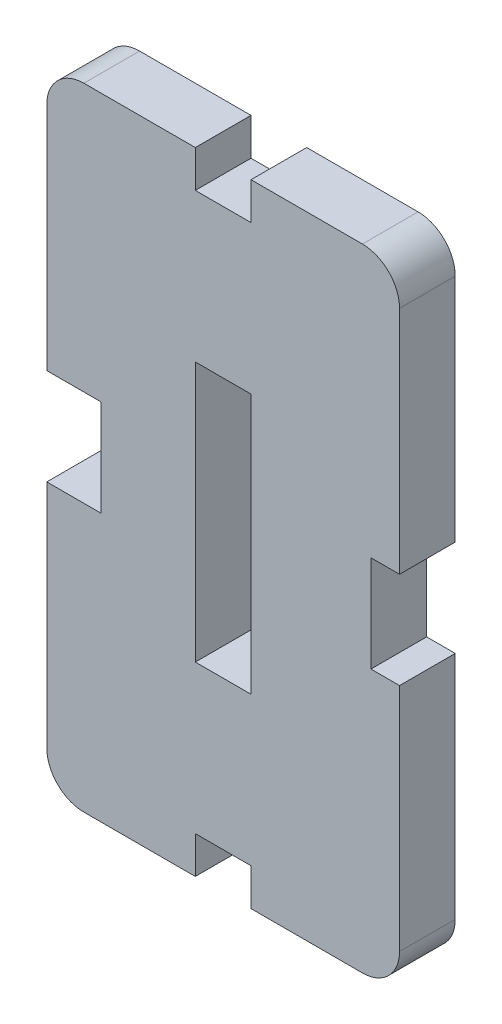
ISO-10303-21;
HEADER;
FILE_DESCRIPTION(('STEP AP214'),'2;1');
FILE_NAME('part.step','',(''),(''),'','','');
FILE_SCHEMA(('AUTOMOTIVE_DESIGN { 1 0 10303 214 1 1 1 1 }'));
ENDSEC;
DATA;
#1=APPLICATION_CONTEXT('core data for automotive mechanical design processes');
#2=APPLICATION_PROTOCOL_DEFINITION('international standard','automotive_design',2000,#1);
#3=PRODUCT_CONTEXT('',#1,'mechanical');
#4=PRODUCT('Part','Part','',(#3));
#5=PRODUCT_RELATED_PRODUCT_CATEGORY('part','',(#4));
#6=PRODUCT_DEFINITION_FORMATION('','',#4);
#7=PRODUCT_DEFINITION_CONTEXT('part definition',#1,'design');
#8=PRODUCT_DEFINITION('design','',#6,#7);
#9=PRODUCT_DEFINITION_SHAPE('','',#8);
#10=(LENGTH_UNIT() NAMED_UNIT(*) SI_UNIT(.MILLI.,.METRE.));
#11=(NAMED_UNIT(*) PLANE_ANGLE_UNIT() SI_UNIT($,.RADIAN.));
#12=(NAMED_UNIT(*) SI_UNIT($,.STERADIAN.) SOLID_ANGLE_UNIT());
#13=UNCERTAINTY_MEASURE_WITH_UNIT(LENGTH_MEASURE(1.E-05),#10,'distance_accuracy_value','');
#14=(GEOMETRIC_REPRESENTATION_CONTEXT(3) GLOBAL_UNCERTAINTY_ASSIGNED_CONTEXT((#13)) GLOBAL_UNIT_ASSIGNED_CONTEXT((#10,
#11,#12)) REPRESENTATION_CONTEXT('',''));
#15=CARTESIAN_POINT('',(0.,0.,0.));
#16=DIRECTION('',(0.,0.,1.));
#17=DIRECTION('',(1.,0.,0.));
#18=AXIS2_PLACEMENT_3D('',#15,#16,#17);
#19=CARTESIAN_POINT('',(-1050.11691061095,53.9977448376063,3.00000000000027));
#20=DIRECTION('',(0.,0.,-1.));
#21=DIRECTION('',(-1.,0.,0.));
#22=AXIS2_PLACEMENT_3D('',#19,#20,#21);
#23=PLANE('',#22);
#24=CARTESIAN_POINT('',(-1050.11691061095,53.9977448376063,3.00000000000027));
#25=DIRECTION('',(0.,0.,1.));
#26=DIRECTION('',(-1.,0.,0.));
#27=AXIS2_PLACEMENT_3D('',#24,#25,#26);
#28=CIRCLE('',#27,2.);
#29=CARTESIAN_POINT('',(-1050.11691061095,55.9977448376064,3.00000000000031));
#30=VERTEX_POINT('',#29);
#31=CARTESIAN_POINT('',(-1052.11691061095,53.9977448376066,3.00000000000047));
#32=VERTEX_POINT('',#31);
#33=EDGE_CURVE('E303',#30,#32,#28,.T.);
#34=ORIENTED_EDGE('',*,*,#33,.T.);
#35=DIRECTION('',(0.,-1.,0.));
#36=VECTOR('',#35,1.);
#37=CARTESIAN_POINT('',(-1052.11691061095,41.5930739118341,3.00000000000052));
#38=LINE('',#37,#36);
#39=CARTESIAN_POINT('',(-1052.11691061095,41.5930739118341,3.00000000000052));
#40=VERTEX_POINT('',#39);
#41=EDGE_CURVE('E306',#32,#40,#38,.T.);
#42=ORIENTED_EDGE('',*,*,#41,.T.);
#43=DIRECTION('',(1.,0.,0.));
#44=VECTOR('',#43,1.);
#45=CARTESIAN_POINT('',(-1049.19041833405,41.593073911834,3.00000000000029));
#46=LINE('',#45,#44);
#47=CARTESIAN_POINT('',(-1049.19041833405,41.593073911834,3.00000000000029));
#48=VERTEX_POINT('',#47);
#49=EDGE_CURVE('E308',#40,#48,#46,.T.);
#50=ORIENTED_EDGE('',*,*,#49,.T.);
#51=DIRECTION('',(0.,-1.,0.));
#52=VECTOR('',#51,1.);
#53=CARTESIAN_POINT('',(-1049.19041833405,36.4024157633791,3.00000000000026));
#54=LINE('',#53,#52);
#55=CARTESIAN_POINT('',(-1049.19041833405,36.4024157633791,3.00000000000026));
#56=VERTEX_POINT('',#55);
#57=EDGE_CURVE('E310',#48,#56,#54,.T.);
#58=ORIENTED_EDGE('',*,*,#57,.T.);
#59=DIRECTION('',(-1.,0.,0.));
#60=VECTOR('',#59,1.);
#61=CARTESIAN_POINT('',(-1049.19041833405,36.4024157633791,3.00000000000026));
#62=LINE('',#61,#60);
#63=CARTESIAN_POINT('',(-1052.11691061095,36.4024157633793,3.00000000000043));
#64=VERTEX_POINT('',#63);
#65=EDGE_CURVE('E312',#56,#64,#62,.T.);
#66=ORIENTED_EDGE('',*,*,#65,.T.);
#67=DIRECTION('',(0.,-1.,0.));
#68=VECTOR('',#67,1.);
#69=CARTESIAN_POINT('',(-1052.11691061095,36.4024157633793,3.00000000000043));
#70=LINE('',#69,#68);
#71=CARTESIAN_POINT('',(-1052.11691061095,23.9977448376065,3.00000000000061));
#72=VERTEX_POINT('',#71);
#73=EDGE_CURVE('E314',#64,#72,#70,.T.);
#74=ORIENTED_EDGE('',*,*,#73,.T.);
#75=CARTESIAN_POINT('',(-1050.11691061095,23.9977448376063,3.00000000000037));
#76=DIRECTION('',(0.,0.,1.));
#77=DIRECTION('',(1.,0.,0.));
#78=AXIS2_PLACEMENT_3D('',#75,#76,#77);
#79=CIRCLE('',#78,2.00000000000011);
#80=CARTESIAN_POINT('',(-1050.11691061095,21.9977448376063,3.00000000000036));
#81=VERTEX_POINT('',#80);
#82=EDGE_CURVE('E316',#72,#81,#79,.T.);
#83=ORIENTED_EDGE('',*,*,#82,.T.);
#84=DIRECTION('',(1.,0.,0.));
#85=VECTOR('',#84,1.);
#86=CARTESIAN_POINT('',(-1050.11691061095,21.9977448376063,3.00000000000023));
#87=LINE('',#86,#85);
#88=CARTESIAN_POINT('',(-1044.11691061095,21.9977448376067,3.00000000000052));
#89=VERTEX_POINT('',#88);
#90=EDGE_CURVE('E318',#81,#89,#87,.T.);
#91=ORIENTED_EDGE('',*,*,#90,.T.);
#92=DIRECTION('',(0.,1.,0.));
#93=VECTOR('',#92,1.);
#94=CARTESIAN_POINT('',(-1044.11691061095,23.9977448376067,3.00000000000052));
#95=LINE('',#94,#93);
#96=CARTESIAN_POINT('',(-1044.11691061095,23.9977448376067,3.00000000000052));
#97=VERTEX_POINT('',#96);
#98=EDGE_CURVE('E320',#89,#97,#95,.T.);
#99=ORIENTED_EDGE('',*,*,#98,.T.);
#100=DIRECTION('',(1.,0.,0.));
#101=VECTOR('',#100,1.);
#102=CARTESIAN_POINT('',(-1042.61691061095,23.9977448376064,3.00000000000032));
#103=LINE('',#102,#101);
#104=CARTESIAN_POINT('',(-1041.11691061095,23.9977448376063,3.00000000000039));
#105=VERTEX_POINT('',#104);
#106=EDGE_CURVE('E322',#97,#105,#103,.T.);
#107=ORIENTED_EDGE('',*,*,#106,.T.);
#108=DIRECTION('',(0.,-1.,0.));
#109=VECTOR('',#108,1.);
#110=CARTESIAN_POINT('',(-1041.11691061095,23.9977448376063,3.00000000000039));
#111=LINE('',#110,#109);
#112=CARTESIAN_POINT('',(-1041.11691061095,21.9977448376064,3.00000000000043));
#113=VERTEX_POINT('',#112);
#114=EDGE_CURVE('E324',#105,#113,#111,.T.);
#115=ORIENTED_EDGE('',*,*,#114,.T.);
#116=DIRECTION('',(1.,0.,0.));
#117=VECTOR('',#116,1.);
#118=CARTESIAN_POINT('',(-1041.11691061095,21.9977448376064,3.00000000000043));
#119=LINE('',#118,#117);
#120=CARTESIAN_POINT('',(-1035.11691061095,21.9977448376063,3.00000000000022));
#121=VERTEX_POINT('',#120);
#122=EDGE_CURVE('E326',#113,#121,#119,.T.);
#123=ORIENTED_EDGE('',*,*,#122,.T.);
#124=CARTESIAN_POINT('',(-1035.11691061095,23.9977448376063,3.00000000000027));
#125=DIRECTION('',(0.,0.,1.));
#126=DIRECTION('',(-1.,0.,0.));
#127=AXIS2_PLACEMENT_3D('',#124,#125,#126);
#128=CIRCLE('',#127,2.);
#129=CARTESIAN_POINT('',(-1033.11691061095,23.9977448376066,3.00000000000048));
#130=VERTEX_POINT('',#129);
#131=EDGE_CURVE('E328',#121,#130,#128,.T.);
#132=ORIENTED_EDGE('',*,*,#131,.T.);
#133=DIRECTION('',(0.,1.,0.));
#134=VECTOR('',#133,1.);
#135=CARTESIAN_POINT('',(-1033.11691061095,23.9977448376066,3.00000000000048));
#136=LINE('',#135,#134);
#137=CARTESIAN_POINT('',(-1033.11691061095,36.4024157633791,3.00000000000038));
#138=VERTEX_POINT('',#137);
#139=EDGE_CURVE('E330',#130,#138,#136,.T.);
#140=ORIENTED_EDGE('',*,*,#139,.T.);
#141=DIRECTION('',(-0.999999999999999,0.,0.));
#142=VECTOR('',#141,1.);
#143=CARTESIAN_POINT('',(-1033.11691061095,36.4024157633791,3.00000000000038));
#144=LINE('',#143,#142);
#145=CARTESIAN_POINT('',(-1034.65769352971,36.402415763379,3.00000000000029));
#146=VERTEX_POINT('',#145);
#147=EDGE_CURVE('E332',#138,#146,#144,.T.);
#148=ORIENTED_EDGE('',*,*,#147,.T.);
#149=DIRECTION('',(0.,1.,0.));
#150=VECTOR('',#149,1.);
#151=CARTESIAN_POINT('',(-1034.65769352971,41.5930739118338,3.00000000000036));
#152=LINE('',#151,#150);
#153=CARTESIAN_POINT('',(-1034.65769352971,41.5930739118338,3.00000000000036));
#154=VERTEX_POINT('',#153);
#155=EDGE_CURVE('E334',#146,#154,#152,.T.);
#156=ORIENTED_EDGE('',*,*,#155,.T.);
#157=DIRECTION('',(0.999999999999999,0.,0.));
#158=VECTOR('',#157,1.);
#159=CARTESIAN_POINT('',(-1033.11691061095,41.5930739118338,3.0000000000005));
#160=LINE('',#159,#158);
#161=CARTESIAN_POINT('',(-1033.11691061095,41.5930739118338,3.0000000000005));
#162=VERTEX_POINT('',#161);
#163=EDGE_CURVE('E336',#154,#162,#160,.T.);
#164=ORIENTED_EDGE('',*,*,#163,.T.);
#165=DIRECTION('',(0.,1.,0.));
#166=VECTOR('',#165,1.);
#167=CARTESIAN_POINT('',(-1033.11691061095,53.9977448376065,3.00000000000048));
#168=LINE('',#167,#166);
#169=CARTESIAN_POINT('',(-1033.11691061095,53.9977448376065,3.00000000000048));
#170=VERTEX_POINT('',#169);
#171=EDGE_CURVE('E338',#162,#170,#168,.T.);
#172=ORIENTED_EDGE('',*,*,#171,.T.);
#173=CARTESIAN_POINT('',(-1035.11691061095,53.9977448376063,3.00000000000022));
#174=DIRECTION('',(0.,0.,1.));
#175=DIRECTION('',(1.,0.,0.));
#176=AXIS2_PLACEMENT_3D('',#173,#174,#175);
#177=CIRCLE('',#176,2.);
#178=CARTESIAN_POINT('',(-1035.11691061095,55.9977448376063,3.0000000000002));
#179=VERTEX_POINT('',#178);
#180=EDGE_CURVE('E340',#170,#179,#177,.T.);
#181=ORIENTED_EDGE('',*,*,#180,.T.);
#182=DIRECTION('',(-1.,0.,0.));
#183=VECTOR('',#182,1.);
#184=CARTESIAN_POINT('',(-1041.11691061095,55.9977448376064,3.00000000000043));
#185=LINE('',#184,#183);
#186=CARTESIAN_POINT('',(-1041.11691061095,55.9977448376064,3.00000000000043));
#187=VERTEX_POINT('',#186);
#188=EDGE_CURVE('E342',#179,#187,#185,.T.);
#189=ORIENTED_EDGE('',*,*,#188,.T.);
#190=DIRECTION('',(0.,-1.,0.));
#191=VECTOR('',#190,1.);
#192=CARTESIAN_POINT('',(-1041.11691061095,53.9977448376063,3.00000000000043));
#193=LINE('',#192,#191);
#194=CARTESIAN_POINT('',(-1041.11691061095,53.9977448376063,3.00000000000043));
#195=VERTEX_POINT('',#194);
#196=EDGE_CURVE('E344',#187,#195,#193,.T.);
#197=ORIENTED_EDGE('',*,*,#196,.T.);
#198=DIRECTION('',(-1.,0.,0.));
#199=VECTOR('',#198,1.);
#200=CARTESIAN_POINT('',(-1042.61691061095,53.9977448376064,3.00000000000046));
#201=LINE('',#200,#199);
#202=CARTESIAN_POINT('',(-1044.11691061095,53.9977448376067,3.00000000000059));
#203=VERTEX_POINT('',#202);
#204=EDGE_CURVE('E346',#195,#203,#201,.T.);
#205=ORIENTED_EDGE('',*,*,#204,.T.);
#206=DIRECTION('',(0.,1.,0.));
#207=VECTOR('',#206,1.);
#208=CARTESIAN_POINT('',(-1044.11691061095,53.9977448376067,3.00000000000059));
#209=LINE('',#208,#207);
#210=CARTESIAN_POINT('',(-1044.11691061095,55.9977448376066,3.00000000000061));
#211=VERTEX_POINT('',#210);
#212=EDGE_CURVE('E348',#203,#211,#209,.T.);
#213=ORIENTED_EDGE('',*,*,#212,.T.);
#214=DIRECTION('',(-1.,0.,0.));
#215=VECTOR('',#214,1.);
#216=CARTESIAN_POINT('',(-1050.11691061095,55.9977448376064,3.00000000000031));
#217=LINE('',#216,#215);
#218=EDGE_CURVE('E350',#211,#30,#217,.T.);
#219=ORIENTED_EDGE('',*,*,#218,.T.);
#220=EDGE_LOOP('',(#34,#42,#50,#58,#66,#74,#83,#91,#99,#107,#115,#123,#132,#140,#148,#156,#164,
#172,#181,#189,#197,#205,#213,#219));
#221=FACE_BOUND('',#220,.T.);
#222=DIRECTION('',(-1.,0.,0.));
#223=VECTOR('',#222,1.);
#224=CARTESIAN_POINT('',(-1041.11691061095,45.9977448376063,3.00000000000037));
#225=LINE('',#224,#223);
#226=CARTESIAN_POINT('',(-1041.11691061095,45.9977448376063,3.00000000000037));
#227=VERTEX_POINT('',#226);
#228=CARTESIAN_POINT('',(-1044.11691061095,45.9977448376067,3.00000000000037));
#229=VERTEX_POINT('',#228);
#230=EDGE_CURVE('E232',#227,#229,#225,.T.);
#231=ORIENTED_EDGE('',*,*,#230,.F.);
#232=DIRECTION('',(0.,1.,0.));
#233=VECTOR('',#232,1.);
#234=CARTESIAN_POINT('',(-1041.11691061095,31.9977448376064,3.00000000000038));
#235=LINE('',#234,#233);
#236=CARTESIAN_POINT('',(-1041.11691061095,31.9977448376064,3.00000000000038));
#237=VERTEX_POINT('',#236);
#238=EDGE_CURVE('E247',#237,#227,#235,.T.);
#239=ORIENTED_EDGE('',*,*,#238,.F.);
#240=DIRECTION('',(1.,0.,0.));
#241=VECTOR('',#240,1.);
#242=CARTESIAN_POINT('',(-1041.11691061095,31.9977448376064,3.00000000000038));
#243=LINE('',#242,#241);
#244=CARTESIAN_POINT('',(-1044.11691061095,31.9977448376065,3.00000000000036));
#245=VERTEX_POINT('',#244);
#246=EDGE_CURVE('E245',#245,#237,#243,.T.);
#247=ORIENTED_EDGE('',*,*,#246,.F.);
#248=DIRECTION('',(0.,-1.,0.));
#249=VECTOR('',#248,1.);
#250=CARTESIAN_POINT('',(-1044.11691061095,45.9977448376067,3.00000000000037));
#251=LINE('',#250,#249);
#252=EDGE_CURVE('E243',#229,#245,#251,.T.);
#253=ORIENTED_EDGE('',*,*,#252,.F.);
#254=EDGE_LOOP('',(#231,#239,#247,#253));
#255=FACE_BOUND('',#254,.T.);
#256=ADVANCED_FACE('F32',(#221,#255),#23,.F.);
#257=CARTESIAN_POINT('',(-1050.11691061095,53.9977448376064,3.2612801348364E-13));
#258=DIRECTION('',(0.,0.,-1.));
#259=DIRECTION('',(-1.,0.,0.));
#260=AXIS2_PLACEMENT_3D('',#257,#258,#259);
#261=PLANE('',#260);
#262=CARTESIAN_POINT('',(-1050.11691061095,53.9977448376064,3.2612801348364E-13));
#263=DIRECTION('',(0.,0.,1.));
#264=DIRECTION('',(-1.,0.,0.));
#265=AXIS2_PLACEMENT_3D('',#262,#263,#264);
#266=CIRCLE('',#265,2.);
#267=CARTESIAN_POINT('',(-1050.11691061095,55.9977448376062,3.19189119579733E-13));
#268=VERTEX_POINT('',#267);
#269=CARTESIAN_POINT('',(-1052.11691061095,53.9977448376066,5.06539254985228E-13));
#270=VERTEX_POINT('',#269);
#271=EDGE_CURVE('E233',#268,#270,#266,.T.);
#272=ORIENTED_EDGE('',*,*,#271,.F.);
#273=DIRECTION('',(-1.,0.,0.));
#274=VECTOR('',#273,1.);
#275=CARTESIAN_POINT('',(-1050.11691061095,55.9977448376062,3.19189119579733E-13));
#276=LINE('',#275,#274);
#277=CARTESIAN_POINT('',(-1044.11691061095,55.9977448376066,4.44089209850063E-13));
#278=VERTEX_POINT('',#277);
#279=EDGE_CURVE('E301',#278,#268,#276,.T.);
#280=ORIENTED_EDGE('',*,*,#279,.F.);
#281=DIRECTION('',(0.,1.,0.));
#282=VECTOR('',#281,1.);
#283=CARTESIAN_POINT('',(-1044.11691061095,53.9977448376066,4.37150315946155E-13));
#284=LINE('',#283,#282);
#285=CARTESIAN_POINT('',(-1044.11691061095,53.9977448376066,4.37150315946155E-13));
#286=VERTEX_POINT('',#285);
#287=EDGE_CURVE('E299',#286,#278,#284,.T.);
#288=ORIENTED_EDGE('',*,*,#287,.F.);
#289=DIRECTION('',(-1.,0.,0.));
#290=VECTOR('',#289,1.);
#291=CARTESIAN_POINT('',(-1042.61691061095,53.9977448376064,3.46944695195361E-13));
#292=LINE('',#291,#290);
#293=CARTESIAN_POINT('',(-1041.11691061095,53.9977448376064,5.13478148889135E-13));
#294=VERTEX_POINT('',#293);
#295=EDGE_CURVE('E297',#294,#286,#292,.T.);
#296=ORIENTED_EDGE('',*,*,#295,.F.);
#297=DIRECTION('',(0.,-1.,0.));
#298=VECTOR('',#297,1.);
#299=CARTESIAN_POINT('',(-1041.11691061095,53.9977448376064,5.13478148889135E-13));
#300=LINE('',#299,#298);
#301=CARTESIAN_POINT('',(-1041.11691061095,55.9977448376064,3.7470027081099E-13));
#302=VERTEX_POINT('',#301);
#303=EDGE_CURVE('E294',#302,#294,#300,.T.);
#304=ORIENTED_EDGE('',*,*,#303,.F.);
#305=DIRECTION('',(-1.,0.,0.));
#306=VECTOR('',#305,1.);
#307=CARTESIAN_POINT('',(-1041.11691061095,55.9977448376064,3.7470027081099E-13));
#308=LINE('',#307,#306);
#309=CARTESIAN_POINT('',(-1035.11691061095,55.9977448376063,1.94289029309402E-13));
#310=VERTEX_POINT('',#309);
#311=EDGE_CURVE('E292',#310,#302,#308,.T.);
#312=ORIENTED_EDGE('',*,*,#311,.F.);
#313=CARTESIAN_POINT('',(-1035.11691061095,53.9977448376064,3.95516952522712E-13));
#314=DIRECTION('',(0.,0.,1.));
#315=DIRECTION('',(1.,0.,0.));
#316=AXIS2_PLACEMENT_3D('',#313,#314,#315);
#317=CIRCLE('',#316,2.);
#318=CARTESIAN_POINT('',(-1033.11691061095,53.9977448376065,4.44089209850063E-13));
#319=VERTEX_POINT('',#318);
#320=EDGE_CURVE('E290',#319,#310,#317,.T.);
#321=ORIENTED_EDGE('',*,*,#320,.F.);
#322=DIRECTION('',(0.,1.,0.));
#323=VECTOR('',#322,1.);
#324=CARTESIAN_POINT('',(-1033.11691061095,53.9977448376065,4.44089209850063E-13));
#325=LINE('',#324,#323);
#326=CARTESIAN_POINT('',(-1033.11691061095,41.593073911834,5.41233724504764E-13));
#327=VERTEX_POINT('',#326);
#328=EDGE_CURVE('E288',#327,#319,#325,.T.);
#329=ORIENTED_EDGE('',*,*,#328,.F.);
#330=DIRECTION('',(0.999999999999999,0.,0.));
#331=VECTOR('',#330,1.);
#332=CARTESIAN_POINT('',(-1033.11691061095,41.593073911834,5.41233724504764E-13));
#333=LINE('',#332,#331);
#334=CARTESIAN_POINT('',(-1034.65769352971,41.5930739118338,3.67761376907083E-13));
#335=VERTEX_POINT('',#334);
#336=EDGE_CURVE('E286',#335,#327,#333,.T.);
#337=ORIENTED_EDGE('',*,*,#336,.F.);
#338=DIRECTION('',(0.,1.,0.));
#339=VECTOR('',#338,1.);
#340=CARTESIAN_POINT('',(-1034.65769352971,41.5930739118338,3.67761376907083E-13));
#341=LINE('',#340,#339);
#342=CARTESIAN_POINT('',(-1034.65769352971,36.402415763379,3.33066907387547E-13));
#343=VERTEX_POINT('',#342);
#344=EDGE_CURVE('E284',#343,#335,#341,.T.);
#345=ORIENTED_EDGE('',*,*,#344,.F.);
#346=DIRECTION('',(-0.999999999999999,0.,0.));
#347=VECTOR('',#346,1.);
#348=CARTESIAN_POINT('',(-1033.11691061095,36.4024157633792,4.5102810375397E-13));
#349=LINE('',#348,#347);
#350=CARTESIAN_POINT('',(-1033.11691061095,36.4024157633792,4.5102810375397E-13));
#351=VERTEX_POINT('',#350);
#352=EDGE_CURVE('E282',#351,#343,#349,.T.);
#353=ORIENTED_EDGE('',*,*,#352,.F.);
#354=DIRECTION('',(0.,1.,0.));
#355=VECTOR('',#354,1.);
#356=CARTESIAN_POINT('',(-1033.11691061095,23.9977448376065,4.09394740330526E-13));
#357=LINE('',#356,#355);
#358=CARTESIAN_POINT('',(-1033.11691061095,23.9977448376065,4.09394740330526E-13));
#359=VERTEX_POINT('',#358);
#360=EDGE_CURVE('E280',#359,#351,#357,.T.);
#361=ORIENTED_EDGE('',*,*,#360,.F.);
#362=CARTESIAN_POINT('',(-1035.11691061095,23.9977448376063,3.2612801348364E-13));
#363=DIRECTION('',(0.,0.,1.));
#364=DIRECTION('',(-1.,0.,0.));
#365=AXIS2_PLACEMENT_3D('',#362,#363,#364);
#366=CIRCLE('',#365,2.);
#367=CARTESIAN_POINT('',(-1035.11691061095,21.9977448376063,1.94289029309402E-13));
#368=VERTEX_POINT('',#367);
#369=EDGE_CURVE('E278',#368,#359,#366,.T.);
#370=ORIENTED_EDGE('',*,*,#369,.F.);
#371=DIRECTION('',(1.,0.,0.));
#372=VECTOR('',#371,1.);
#373=CARTESIAN_POINT('',(-1041.11691061095,21.9977448376064,4.23272528138341E-13));
#374=LINE('',#373,#372);
#375=CARTESIAN_POINT('',(-1041.11691061095,21.9977448376064,4.23272528138341E-13));
#376=VERTEX_POINT('',#375);
#377=EDGE_CURVE('E276',#376,#368,#374,.T.);
#378=ORIENTED_EDGE('',*,*,#377,.F.);
#379=DIRECTION('',(0.,-1.,0.));
#380=VECTOR('',#379,1.);
#381=CARTESIAN_POINT('',(-1041.11691061095,23.9977448376064,4.09394740330526E-13));
#382=LINE('',#381,#380);
#383=CARTESIAN_POINT('',(-1041.11691061095,23.9977448376064,4.09394740330526E-13));
#384=VERTEX_POINT('',#383);
#385=EDGE_CURVE('E274',#384,#376,#382,.T.);
#386=ORIENTED_EDGE('',*,*,#385,.F.);
#387=DIRECTION('',(1.,0.,0.));
#388=VECTOR('',#387,1.);
#389=CARTESIAN_POINT('',(-1042.61691061095,23.9977448376066,4.37150315946155E-13));
#390=LINE('',#389,#388);
#391=CARTESIAN_POINT('',(-1044.11691061095,23.9977448376067,4.85722573273506E-13));
#392=VERTEX_POINT('',#391);
#393=EDGE_CURVE('E272',#392,#384,#390,.T.);
#394=ORIENTED_EDGE('',*,*,#393,.F.);
#395=DIRECTION('',(0.,1.,0.));
#396=VECTOR('',#395,1.);
#397=CARTESIAN_POINT('',(-1044.11691061095,23.9977448376067,4.85722573273506E-13));
#398=LINE('',#397,#396);
#399=CARTESIAN_POINT('',(-1044.11691061095,21.9977448376066,4.57966997657877E-13));
#400=VERTEX_POINT('',#399);
#401=EDGE_CURVE('E269',#400,#392,#398,.T.);
#402=ORIENTED_EDGE('',*,*,#401,.F.);
#403=DIRECTION('',(1.,0.,0.));
#404=VECTOR('',#403,1.);
#405=CARTESIAN_POINT('',(-1050.11691061095,21.9977448376063,3.67761376907083E-13));
#406=LINE('',#405,#404);
#407=CARTESIAN_POINT('',(-1050.11691061095,21.9977448376062,4.16333634234434E-13));
#408=VERTEX_POINT('',#407);
#409=EDGE_CURVE('E267',#408,#400,#406,.T.);
#410=ORIENTED_EDGE('',*,*,#409,.F.);
#411=CARTESIAN_POINT('',(-1050.11691061095,23.9977448376065,4.09394740330526E-13));
#412=DIRECTION('',(0.,0.,1.));
#413=DIRECTION('',(1.,0.,0.));
#414=AXIS2_PLACEMENT_3D('',#411,#412,#413);
#415=CIRCLE('',#414,2.00000000000011);
#416=CARTESIAN_POINT('',(-1052.11691061095,23.9977448376065,5.68989300120393E-13));
#417=VERTEX_POINT('',#416);
#418=EDGE_CURVE('E265',#417,#408,#415,.T.);
#419=ORIENTED_EDGE('',*,*,#418,.F.);
#420=DIRECTION('',(0.,-1.,0.));
#421=VECTOR('',#420,1.);
#422=CARTESIAN_POINT('',(-1052.11691061095,36.4024157633792,5.759281940243E-13));
#423=LINE('',#422,#421);
#424=CARTESIAN_POINT('',(-1052.11691061095,36.4024157633792,5.759281940243E-13));
#425=VERTEX_POINT('',#424);
#426=EDGE_CURVE('E263',#425,#417,#423,.T.);
#427=ORIENTED_EDGE('',*,*,#426,.F.);
#428=DIRECTION('',(-1.,0.,0.));
#429=VECTOR('',#428,1.);
#430=CARTESIAN_POINT('',(-1049.19041833405,36.4024157633793,2.63677968348475E-13));
#431=LINE('',#430,#429);
#432=CARTESIAN_POINT('',(-1049.19041833405,36.4024157633793,2.63677968348475E-13));
#433=VERTEX_POINT('',#432);
#434=EDGE_CURVE('E261',#433,#425,#431,.T.);
#435=ORIENTED_EDGE('',*,*,#434,.F.);
#436=DIRECTION('',(0.,-1.,0.));
#437=VECTOR('',#436,1.);
#438=CARTESIAN_POINT('',(-1049.19041833405,36.4024157633793,2.63677968348475E-13));
#439=LINE('',#438,#437);
#440=CARTESIAN_POINT('',(-1049.19041833405,41.5930739118339,3.67761376907083E-13));
#441=VERTEX_POINT('',#440);
#442=EDGE_CURVE('E259',#441,#433,#439,.T.);
#443=ORIENTED_EDGE('',*,*,#442,.F.);
#444=DIRECTION('',(1.,0.,0.));
#445=VECTOR('',#444,1.);
#446=CARTESIAN_POINT('',(-1049.19041833405,41.5930739118339,3.67761376907083E-13));
#447=LINE('',#446,#445);
#448=CARTESIAN_POINT('',(-1052.11691061095,41.5930739118341,6.73072708679001E-13));
#449=VERTEX_POINT('',#448);
#450=EDGE_CURVE('E257',#449,#441,#447,.T.);
#451=ORIENTED_EDGE('',*,*,#450,.F.);
#452=DIRECTION('',(0.,-1.,0.));
#453=VECTOR('',#452,1.);
#454=CARTESIAN_POINT('',(-1052.11691061095,41.5930739118341,6.73072708679001E-13));
#455=LINE('',#454,#453);
#456=EDGE_CURVE('E255',#270,#449,#455,.T.);
#457=ORIENTED_EDGE('',*,*,#456,.F.);
#458=EDGE_LOOP('',(#272,#280,#288,#296,#304,#312,#321,#329,#337,#345,#353,#361,#370,#378,#386,
#394,#402,#410,#419,#427,#435,#443,#451,#457));
#459=FACE_BOUND('',#458,.T.);
#460=DIRECTION('',(0.,1.,0.));
#461=VECTOR('',#460,1.);
#462=CARTESIAN_POINT('',(-1041.11691061095,31.9977448376064,3.81639164714898E-13));
#463=LINE('',#462,#461);
#464=CARTESIAN_POINT('',(-1041.11691061095,31.9977448376064,3.81639164714898E-13));
#465=VERTEX_POINT('',#464);
#466=CARTESIAN_POINT('',(-1041.11691061095,45.9977448376064,4.85722573273506E-13));
#467=VERTEX_POINT('',#466);
#468=EDGE_CURVE('E237',#465,#467,#463,.T.);
#469=ORIENTED_EDGE('',*,*,#468,.T.);
#470=DIRECTION('',(-1.,0.,0.));
#471=VECTOR('',#470,1.);
#472=CARTESIAN_POINT('',(-1041.11691061095,45.9977448376064,4.85722573273506E-13));
#473=LINE('',#472,#471);
#474=CARTESIAN_POINT('',(-1044.11691061095,45.9977448376067,4.30211422042248E-13));
#475=VERTEX_POINT('',#474);
#476=EDGE_CURVE('E55',#467,#475,#473,.T.);
#477=ORIENTED_EDGE('',*,*,#476,.T.);
#478=DIRECTION('',(0.,-1.,0.));
#479=VECTOR('',#478,1.);
#480=CARTESIAN_POINT('',(-1044.11691061095,45.9977448376067,4.30211422042248E-13));
#481=LINE('',#480,#479);
#482=CARTESIAN_POINT('',(-1044.11691061095,31.9977448376067,3.05311331771918E-13));
#483=VERTEX_POINT('',#482);
#484=EDGE_CURVE('E219',#475,#483,#481,.T.);
#485=ORIENTED_EDGE('',*,*,#484,.T.);
#486=DIRECTION('',(1.,0.,0.));
#487=VECTOR('',#486,1.);
#488=CARTESIAN_POINT('',(-1041.11691061095,31.9977448376064,3.81639164714898E-13));
#489=LINE('',#488,#487);
#490=EDGE_CURVE('E228',#483,#465,#489,.T.);
#491=ORIENTED_EDGE('',*,*,#490,.T.);
#492=EDGE_LOOP('',(#469,#477,#485,#491));
#493=FACE_BOUND('',#492,.T.);
#494=ADVANCED_FACE('F236',(#459,#493),#261,.T.);
#495=CARTESIAN_POINT('',(-1050.11691061095,53.9977448376063,3.00000000000027));
#496=DIRECTION('',(0.,0.,-1.));
#497=DIRECTION('',(-1.,0.,0.));
#498=AXIS2_PLACEMENT_3D('',#495,#496,#497);
#499=CYLINDRICAL_SURFACE('',#498,2.);
#500=ORIENTED_EDGE('',*,*,#271,.T.);
#501=DIRECTION('',(0.,0.,-1.));
#502=VECTOR('',#501,1.);
#503=CARTESIAN_POINT('',(-1052.11691061095,53.9977448376066,3.00000000000047));
#504=LINE('',#503,#502);
#505=EDGE_CURVE('E11',#32,#270,#504,.T.);
#506=ORIENTED_EDGE('',*,*,#505,.F.);
#507=ORIENTED_EDGE('',*,*,#33,.F.);
#508=DIRECTION('',(0.,0.,-1.));
#509=VECTOR('',#508,1.);
#510=CARTESIAN_POINT('',(-1050.11691061095,55.9977448376064,3.00000000000031));
#511=LINE('',#510,#509);
#512=EDGE_CURVE('E352',#30,#268,#511,.T.);
#513=ORIENTED_EDGE('',*,*,#512,.T.);
#514=EDGE_LOOP('',(#500,#506,#507,#513));
#515=FACE_BOUND('',#514,.T.);
#516=ADVANCED_FACE('F34',(#515),#499,.T.);
#517=CARTESIAN_POINT('',(-1052.11691061095,41.5930739118341,3.00000000000052));
#518=DIRECTION('',(1.,0.,0.));
#519=DIRECTION('',(0.,1.,0.));
#520=AXIS2_PLACEMENT_3D('',#517,#518,#519);
#521=PLANE('',#520);
#522=ORIENTED_EDGE('',*,*,#456,.T.);
#523=DIRECTION('',(0.,0.,-1.));
#524=VECTOR('',#523,1.);
#525=CARTESIAN_POINT('',(-1052.11691061095,41.5930739118341,3.00000000000052));
#526=LINE('',#525,#524);
#527=EDGE_CURVE('E40',#40,#449,#526,.T.);
#528=ORIENTED_EDGE('',*,*,#527,.F.);
#529=ORIENTED_EDGE('',*,*,#41,.F.);
#530=ORIENTED_EDGE('',*,*,#505,.T.);
#531=EDGE_LOOP('',(#522,#528,#529,#530));
#532=FACE_BOUND('',#531,.T.);
#533=ADVANCED_FACE('F444',(#532),#521,.F.);
#534=CARTESIAN_POINT('',(-1049.19041833405,41.593073911834,3.00000000000029));
#535=DIRECTION('',(0.,1.,0.));
#536=DIRECTION('',(0.,0.,1.));
#537=AXIS2_PLACEMENT_3D('',#534,#535,#536);
#538=PLANE('',#537);
#539=ORIENTED_EDGE('',*,*,#450,.T.);
#540=DIRECTION('',(0.,0.,-1.));
#541=VECTOR('',#540,1.);
#542=CARTESIAN_POINT('',(-1049.19041833405,41.593073911834,3.00000000000029));
#543=LINE('',#542,#541);
#544=EDGE_CURVE('E415',#48,#441,#543,.T.);
#545=ORIENTED_EDGE('',*,*,#544,.F.);
#546=ORIENTED_EDGE('',*,*,#49,.F.);
#547=ORIENTED_EDGE('',*,*,#527,.T.);
#548=EDGE_LOOP('',(#539,#545,#546,#547));
#549=FACE_BOUND('',#548,.T.);
#550=ADVANCED_FACE('F422',(#549),#538,.F.);
#551=CARTESIAN_POINT('',(-1049.19041833405,36.4024157633791,3.00000000000026));
#552=DIRECTION('',(1.,0.,0.));
#553=DIRECTION('',(0.,0.,-1.));
#554=AXIS2_PLACEMENT_3D('',#551,#552,#553);
#555=PLANE('',#554);
#556=ORIENTED_EDGE('',*,*,#442,.T.);
#557=DIRECTION('',(0.,0.,-1.));
#558=VECTOR('',#557,1.);
#559=CARTESIAN_POINT('',(-1049.19041833405,36.4024157633791,3.00000000000026));
#560=LINE('',#559,#558);
#561=EDGE_CURVE('E412',#56,#433,#560,.T.);
#562=ORIENTED_EDGE('',*,*,#561,.F.);
#563=ORIENTED_EDGE('',*,*,#57,.F.);
#564=ORIENTED_EDGE('',*,*,#544,.T.);
#565=EDGE_LOOP('',(#556,#562,#563,#564));
#566=FACE_BOUND('',#565,.T.);
#567=ADVANCED_FACE('F432',(#566),#555,.F.);
#568=CARTESIAN_POINT('',(-1049.19041833405,36.4024157633791,3.00000000000026));
#569=DIRECTION('',(0.,-1.,0.));
#570=DIRECTION('',(0.,0.,-1.));
#571=AXIS2_PLACEMENT_3D('',#568,#569,#570);
#572=PLANE('',#571);
#573=ORIENTED_EDGE('',*,*,#434,.T.);
#574=DIRECTION('',(0.,0.,-1.));
#575=VECTOR('',#574,1.);
#576=CARTESIAN_POINT('',(-1052.11691061095,36.4024157633793,3.00000000000043));
#577=LINE('',#576,#575);
#578=EDGE_CURVE('E409',#64,#425,#577,.T.);
#579=ORIENTED_EDGE('',*,*,#578,.F.);
#580=ORIENTED_EDGE('',*,*,#65,.F.);
#581=ORIENTED_EDGE('',*,*,#561,.T.);
#582=EDGE_LOOP('',(#573,#579,#580,#581));
#583=FACE_BOUND('',#582,.T.);
#584=ADVANCED_FACE('F436',(#583),#572,.F.);
#585=CARTESIAN_POINT('',(-1052.11691061095,36.4024157633793,3.00000000000043));
#586=DIRECTION('',(1.,0.,0.));
#587=DIRECTION('',(0.,1.,0.));
#588=AXIS2_PLACEMENT_3D('',#585,#586,#587);
#589=PLANE('',#588);
#590=ORIENTED_EDGE('',*,*,#426,.T.);
#591=DIRECTION('',(0.,0.,-1.));
#592=VECTOR('',#591,1.);
#593=CARTESIAN_POINT('',(-1052.11691061095,23.9977448376065,3.00000000000061));
#594=LINE('',#593,#592);
#595=EDGE_CURVE('E406',#72,#417,#594,.T.);
#596=ORIENTED_EDGE('',*,*,#595,.F.);
#597=ORIENTED_EDGE('',*,*,#73,.F.);
#598=ORIENTED_EDGE('',*,*,#578,.T.);
#599=EDGE_LOOP('',(#590,#596,#597,#598));
#600=FACE_BOUND('',#599,.T.);
#601=ADVANCED_FACE('F535',(#600),#589,.F.);
#602=CARTESIAN_POINT('',(-1050.11691061095,23.9977448376063,3.00000000000037));
#603=DIRECTION('',(0.,0.,-1.));
#604=DIRECTION('',(-1.,0.,0.));
#605=AXIS2_PLACEMENT_3D('',#602,#603,#604);
#606=CYLINDRICAL_SURFACE('',#605,2.00000000000011);
#607=ORIENTED_EDGE('',*,*,#418,.T.);
#608=DIRECTION('',(0.,0.,-1.));
#609=VECTOR('',#608,1.);
#610=CARTESIAN_POINT('',(-1050.11691061095,21.9977448376063,3.00000000000036));
#611=LINE('',#610,#609);
#612=EDGE_CURVE('E403',#81,#408,#611,.T.);
#613=ORIENTED_EDGE('',*,*,#612,.F.);
#614=ORIENTED_EDGE('',*,*,#82,.F.);
#615=ORIENTED_EDGE('',*,*,#595,.T.);
#616=EDGE_LOOP('',(#607,#613,#614,#615));
#617=FACE_BOUND('',#616,.T.);
#618=ADVANCED_FACE('F533',(#617),#606,.T.);
#619=CARTESIAN_POINT('',(-1050.11691061095,21.9977448376063,3.00000000000023));
#620=DIRECTION('',(0.,1.,0.));
#621=DIRECTION('',(0.,0.,1.));
#622=AXIS2_PLACEMENT_3D('',#619,#620,#621);
#623=PLANE('',#622);
#624=ORIENTED_EDGE('',*,*,#409,.T.);
#625=DIRECTION('',(0.,0.,-1.));
#626=VECTOR('',#625,1.);
#627=CARTESIAN_POINT('',(-1044.11691061095,21.9977448376067,3.00000000000052));
#628=LINE('',#627,#626);
#629=EDGE_CURVE('E400',#89,#400,#628,.T.);
#630=ORIENTED_EDGE('',*,*,#629,.F.);
#631=ORIENTED_EDGE('',*,*,#90,.F.);
#632=ORIENTED_EDGE('',*,*,#612,.T.);
#633=EDGE_LOOP('',(#624,#630,#631,#632));
#634=FACE_BOUND('',#633,.T.);
#635=ADVANCED_FACE('F530',(#634),#623,.F.);
#636=CARTESIAN_POINT('',(-1044.11691061095,23.9977448376067,3.00000000000052));
#637=DIRECTION('',(-1.,0.,0.));
#638=DIRECTION('',(0.,0.,1.));
#639=AXIS2_PLACEMENT_3D('',#636,#637,#638);
#640=PLANE('',#639);
#641=ORIENTED_EDGE('',*,*,#401,.T.);
#642=DIRECTION('',(0.,0.,-1.));
#643=VECTOR('',#642,1.);
#644=CARTESIAN_POINT('',(-1044.11691061095,23.9977448376067,3.00000000000052));
#645=LINE('',#644,#643);
#646=EDGE_CURVE('E397',#97,#392,#645,.T.);
#647=ORIENTED_EDGE('',*,*,#646,.F.);
#648=ORIENTED_EDGE('',*,*,#98,.F.);
#649=ORIENTED_EDGE('',*,*,#629,.T.);
#650=EDGE_LOOP('',(#641,#647,#648,#649));
#651=FACE_BOUND('',#650,.T.);
#652=ADVANCED_FACE('F521',(#651),#640,.F.);
#653=CARTESIAN_POINT('',(-1042.61691061095,23.9977448376064,3.00000000000032));
#654=DIRECTION('',(0.,1.,0.));
#655=DIRECTION('',(0.,0.,1.));
#656=AXIS2_PLACEMENT_3D('',#653,#654,#655);
#657=PLANE('',#656);
#658=ORIENTED_EDGE('',*,*,#393,.T.);
#659=DIRECTION('',(0.,0.,-1.));
#660=VECTOR('',#659,1.);
#661=CARTESIAN_POINT('',(-1041.11691061095,23.9977448376063,3.00000000000039));
#662=LINE('',#661,#660);
#663=EDGE_CURVE('E394',#105,#384,#662,.T.);
#664=ORIENTED_EDGE('',*,*,#663,.F.);
#665=ORIENTED_EDGE('',*,*,#106,.F.);
#666=ORIENTED_EDGE('',*,*,#646,.T.);
#667=EDGE_LOOP('',(#658,#664,#665,#666));
#668=FACE_BOUND('',#667,.T.);
#669=ADVANCED_FACE('F525',(#668),#657,.F.);
#670=CARTESIAN_POINT('',(-1041.11691061095,23.9977448376063,3.00000000000039));
#671=DIRECTION('',(1.,0.,0.));
#672=DIRECTION('',(0.,0.,-1.));
#673=AXIS2_PLACEMENT_3D('',#670,#671,#672);
#674=PLANE('',#673);
#675=ORIENTED_EDGE('',*,*,#385,.T.);
#676=DIRECTION('',(0.,0.,-1.));
#677=VECTOR('',#676,1.);
#678=CARTESIAN_POINT('',(-1041.11691061095,21.9977448376064,3.00000000000043));
#679=LINE('',#678,#677);
#680=EDGE_CURVE('E391',#113,#376,#679,.T.);
#681=ORIENTED_EDGE('',*,*,#680,.F.);
#682=ORIENTED_EDGE('',*,*,#114,.F.);
#683=ORIENTED_EDGE('',*,*,#663,.T.);
#684=EDGE_LOOP('',(#675,#681,#682,#683));
#685=FACE_BOUND('',#684,.T.);
#686=ADVANCED_FACE('F514',(#685),#674,.F.);
#687=CARTESIAN_POINT('',(-1041.11691061095,21.9977448376064,3.00000000000043));
#688=DIRECTION('',(0.,1.,0.));
#689=DIRECTION('',(0.,0.,1.));
#690=AXIS2_PLACEMENT_3D('',#687,#688,#689);
#691=PLANE('',#690);
#692=ORIENTED_EDGE('',*,*,#377,.T.);
#693=DIRECTION('',(0.,0.,-1.));
#694=VECTOR('',#693,1.);
#695=CARTESIAN_POINT('',(-1035.11691061095,21.9977448376063,3.00000000000022));
#696=LINE('',#695,#694);
#697=EDGE_CURVE('E388',#121,#368,#696,.T.);
#698=ORIENTED_EDGE('',*,*,#697,.F.);
#699=ORIENTED_EDGE('',*,*,#122,.F.);
#700=ORIENTED_EDGE('',*,*,#680,.T.);
#701=EDGE_LOOP('',(#692,#698,#699,#700));
#702=FACE_BOUND('',#701,.T.);
#703=ADVANCED_FACE('F510',(#702),#691,.F.);
#704=CARTESIAN_POINT('',(-1035.11691061095,23.9977448376063,3.00000000000027));
#705=DIRECTION('',(0.,0.,-1.));
#706=DIRECTION('',(-1.,0.,0.));
#707=AXIS2_PLACEMENT_3D('',#704,#705,#706);
#708=CYLINDRICAL_SURFACE('',#707,2.);
#709=ORIENTED_EDGE('',*,*,#369,.T.);
#710=DIRECTION('',(0.,0.,-1.));
#711=VECTOR('',#710,1.);
#712=CARTESIAN_POINT('',(-1033.11691061095,23.9977448376066,3.00000000000048));
#713=LINE('',#712,#711);
#714=EDGE_CURVE('E385',#130,#359,#713,.T.);
#715=ORIENTED_EDGE('',*,*,#714,.F.);
#716=ORIENTED_EDGE('',*,*,#131,.F.);
#717=ORIENTED_EDGE('',*,*,#697,.T.);
#718=EDGE_LOOP('',(#709,#715,#716,#717));
#719=FACE_BOUND('',#718,.T.);
#720=ADVANCED_FACE('F505',(#719),#708,.T.);
#721=CARTESIAN_POINT('',(-1033.11691061095,23.9977448376066,3.00000000000048));
#722=DIRECTION('',(-1.,0.,0.));
#723=DIRECTION('',(0.,0.,1.));
#724=AXIS2_PLACEMENT_3D('',#721,#722,#723);
#725=PLANE('',#724);
#726=ORIENTED_EDGE('',*,*,#360,.T.);
#727=DIRECTION('',(0.,0.,-1.));
#728=VECTOR('',#727,1.);
#729=CARTESIAN_POINT('',(-1033.11691061095,36.4024157633791,3.00000000000038));
#730=LINE('',#729,#728);
#731=EDGE_CURVE('E382',#138,#351,#730,.T.);
#732=ORIENTED_EDGE('',*,*,#731,.F.);
#733=ORIENTED_EDGE('',*,*,#139,.F.);
#734=ORIENTED_EDGE('',*,*,#714,.T.);
#735=EDGE_LOOP('',(#726,#732,#733,#734));
#736=FACE_BOUND('',#735,.T.);
#737=ADVANCED_FACE('F499',(#736),#725,.F.);
#738=CARTESIAN_POINT('',(-1033.11691061095,36.4024157633791,3.00000000000038));
#739=DIRECTION('',(0.,-1.,0.));
#740=DIRECTION('',(0.,0.,-1.));
#741=AXIS2_PLACEMENT_3D('',#738,#739,#740);
#742=PLANE('',#741);
#743=ORIENTED_EDGE('',*,*,#352,.T.);
#744=DIRECTION('',(0.,0.,-1.));
#745=VECTOR('',#744,1.);
#746=CARTESIAN_POINT('',(-1034.65769352971,36.402415763379,3.00000000000029));
#747=LINE('',#746,#745);
#748=EDGE_CURVE('E379',#146,#343,#747,.T.);
#749=ORIENTED_EDGE('',*,*,#748,.F.);
#750=ORIENTED_EDGE('',*,*,#147,.F.);
#751=ORIENTED_EDGE('',*,*,#731,.T.);
#752=EDGE_LOOP('',(#743,#749,#750,#751));
#753=FACE_BOUND('',#752,.T.);
#754=ADVANCED_FACE('F495',(#753),#742,.F.);
#755=CARTESIAN_POINT('',(-1034.65769352971,41.5930739118338,3.00000000000036));
#756=DIRECTION('',(-1.,0.,0.));
#757=DIRECTION('',(0.,0.,1.));
#758=AXIS2_PLACEMENT_3D('',#755,#756,#757);
#759=PLANE('',#758);
#760=ORIENTED_EDGE('',*,*,#344,.T.);
#761=DIRECTION('',(0.,0.,-1.));
#762=VECTOR('',#761,1.);
#763=CARTESIAN_POINT('',(-1034.65769352971,41.5930739118338,3.00000000000036));
#764=LINE('',#763,#762);
#765=EDGE_CURVE('E376',#154,#335,#764,.T.);
#766=ORIENTED_EDGE('',*,*,#765,.F.);
#767=ORIENTED_EDGE('',*,*,#155,.F.);
#768=ORIENTED_EDGE('',*,*,#748,.T.);
#769=EDGE_LOOP('',(#760,#766,#767,#768));
#770=FACE_BOUND('',#769,.T.);
#771=ADVANCED_FACE('F490',(#770),#759,.F.);
#772=CARTESIAN_POINT('',(-1033.11691061095,41.5930739118338,3.0000000000005));
#773=DIRECTION('',(0.,1.,0.));
#774=DIRECTION('',(0.,0.,1.));
#775=AXIS2_PLACEMENT_3D('',#772,#773,#774);
#776=PLANE('',#775);
#777=ORIENTED_EDGE('',*,*,#336,.T.);
#778=DIRECTION('',(0.,0.,-1.));
#779=VECTOR('',#778,1.);
#780=CARTESIAN_POINT('',(-1033.11691061095,41.5930739118338,3.0000000000005));
#781=LINE('',#780,#779);
#782=EDGE_CURVE('E373',#162,#327,#781,.T.);
#783=ORIENTED_EDGE('',*,*,#782,.F.);
#784=ORIENTED_EDGE('',*,*,#163,.F.);
#785=ORIENTED_EDGE('',*,*,#765,.T.);
#786=EDGE_LOOP('',(#777,#783,#784,#785));
#787=FACE_BOUND('',#786,.T.);
#788=ADVANCED_FACE('F484',(#787),#776,.F.);
#789=CARTESIAN_POINT('',(-1033.11691061095,53.9977448376065,3.00000000000048));
#790=DIRECTION('',(-1.,0.,0.));
#791=DIRECTION('',(0.,0.,1.));
#792=AXIS2_PLACEMENT_3D('',#789,#790,#791);
#793=PLANE('',#792);
#794=ORIENTED_EDGE('',*,*,#328,.T.);
#795=DIRECTION('',(0.,0.,-1.));
#796=VECTOR('',#795,1.);
#797=CARTESIAN_POINT('',(-1033.11691061095,53.9977448376065,3.00000000000048));
#798=LINE('',#797,#796);
#799=EDGE_CURVE('E370',#170,#319,#798,.T.);
#800=ORIENTED_EDGE('',*,*,#799,.F.);
#801=ORIENTED_EDGE('',*,*,#171,.F.);
#802=ORIENTED_EDGE('',*,*,#782,.T.);
#803=EDGE_LOOP('',(#794,#800,#801,#802));
#804=FACE_BOUND('',#803,.T.);
#805=ADVANCED_FACE('F480',(#804),#793,.F.);
#806=CARTESIAN_POINT('',(-1035.11691061095,53.9977448376063,3.00000000000022));
#807=DIRECTION('',(0.,0.,-1.));
#808=DIRECTION('',(-1.,0.,0.));
#809=AXIS2_PLACEMENT_3D('',#806,#807,#808);
#810=CYLINDRICAL_SURFACE('',#809,2.);
#811=ORIENTED_EDGE('',*,*,#320,.T.);
#812=DIRECTION('',(0.,0.,-1.));
#813=VECTOR('',#812,1.);
#814=CARTESIAN_POINT('',(-1035.11691061095,55.9977448376063,3.0000000000002));
#815=LINE('',#814,#813);
#816=EDGE_CURVE('E367',#179,#310,#815,.T.);
#817=ORIENTED_EDGE('',*,*,#816,.F.);
#818=ORIENTED_EDGE('',*,*,#180,.F.);
#819=ORIENTED_EDGE('',*,*,#799,.T.);
#820=EDGE_LOOP('',(#811,#817,#818,#819));
#821=FACE_BOUND('',#820,.T.);
#822=ADVANCED_FACE('F475',(#821),#810,.T.);
#823=CARTESIAN_POINT('',(-1041.11691061095,55.9977448376064,3.00000000000043));
#824=DIRECTION('',(0.,-1.,0.));
#825=DIRECTION('',(0.,0.,-1.));
#826=AXIS2_PLACEMENT_3D('',#823,#824,#825);
#827=PLANE('',#826);
#828=ORIENTED_EDGE('',*,*,#311,.T.);
#829=DIRECTION('',(0.,0.,-1.));
#830=VECTOR('',#829,1.);
#831=CARTESIAN_POINT('',(-1041.11691061095,55.9977448376064,3.00000000000043));
#832=LINE('',#831,#830);
#833=EDGE_CURVE('E364',#187,#302,#832,.T.);
#834=ORIENTED_EDGE('',*,*,#833,.F.);
#835=ORIENTED_EDGE('',*,*,#188,.F.);
#836=ORIENTED_EDGE('',*,*,#816,.T.);
#837=EDGE_LOOP('',(#828,#834,#835,#836));
#838=FACE_BOUND('',#837,.T.);
#839=ADVANCED_FACE('F469',(#838),#827,.F.);
#840=CARTESIAN_POINT('',(-1041.11691061095,53.9977448376063,3.00000000000043));
#841=DIRECTION('',(1.,0.,0.));
#842=DIRECTION('',(0.,0.,-1.));
#843=AXIS2_PLACEMENT_3D('',#840,#841,#842);
#844=PLANE('',#843);
#845=ORIENTED_EDGE('',*,*,#303,.T.);
#846=DIRECTION('',(0.,0.,-1.));
#847=VECTOR('',#846,1.);
#848=CARTESIAN_POINT('',(-1041.11691061095,53.9977448376063,3.00000000000043));
#849=LINE('',#848,#847);
#850=EDGE_CURVE('E361',#195,#294,#849,.T.);
#851=ORIENTED_EDGE('',*,*,#850,.F.);
#852=ORIENTED_EDGE('',*,*,#196,.F.);
#853=ORIENTED_EDGE('',*,*,#833,.T.);
#854=EDGE_LOOP('',(#845,#851,#852,#853));
#855=FACE_BOUND('',#854,.T.);
#856=ADVANCED_FACE('F464',(#855),#844,.F.);
#857=CARTESIAN_POINT('',(-1042.61691061095,53.9977448376064,3.00000000000046));
#858=DIRECTION('',(0.,-1.,0.));
#859=DIRECTION('',(1.,0.,0.));
#860=AXIS2_PLACEMENT_3D('',#857,#858,#859);
#861=PLANE('',#860);
#862=ORIENTED_EDGE('',*,*,#295,.T.);
#863=DIRECTION('',(0.,0.,-1.));
#864=VECTOR('',#863,1.);
#865=CARTESIAN_POINT('',(-1044.11691061095,53.9977448376067,3.00000000000059));
#866=LINE('',#865,#864);
#867=EDGE_CURVE('E358',#203,#286,#866,.T.);
#868=ORIENTED_EDGE('',*,*,#867,.F.);
#869=ORIENTED_EDGE('',*,*,#204,.F.);
#870=ORIENTED_EDGE('',*,*,#850,.T.);
#871=EDGE_LOOP('',(#862,#868,#869,#870));
#872=FACE_BOUND('',#871,.T.);
#873=ADVANCED_FACE('F459',(#872),#861,.F.);
#874=CARTESIAN_POINT('',(-1044.11691061095,53.9977448376067,3.00000000000059));
#875=DIRECTION('',(-1.,0.,0.));
#876=DIRECTION('',(0.,0.,1.));
#877=AXIS2_PLACEMENT_3D('',#874,#875,#876);
#878=PLANE('',#877);
#879=ORIENTED_EDGE('',*,*,#287,.T.);
#880=DIRECTION('',(0.,0.,-1.));
#881=VECTOR('',#880,1.);
#882=CARTESIAN_POINT('',(-1044.11691061095,55.9977448376066,3.00000000000061));
#883=LINE('',#882,#881);
#884=EDGE_CURVE('E355',#211,#278,#883,.T.);
#885=ORIENTED_EDGE('',*,*,#884,.F.);
#886=ORIENTED_EDGE('',*,*,#212,.F.);
#887=ORIENTED_EDGE('',*,*,#867,.T.);
#888=EDGE_LOOP('',(#879,#885,#886,#887));
#889=FACE_BOUND('',#888,.T.);
#890=ADVANCED_FACE('F455',(#889),#878,.F.);
#891=CARTESIAN_POINT('',(-1050.11691061095,55.9977448376064,3.00000000000031));
#892=DIRECTION('',(0.,-1.,0.));
#893=DIRECTION('',(0.,0.,-1.));
#894=AXIS2_PLACEMENT_3D('',#891,#892,#893);
#895=PLANE('',#894);
#896=ORIENTED_EDGE('',*,*,#279,.T.);
#897=ORIENTED_EDGE('',*,*,#512,.F.);
#898=ORIENTED_EDGE('',*,*,#218,.F.);
#899=ORIENTED_EDGE('',*,*,#884,.T.);
#900=EDGE_LOOP('',(#896,#897,#898,#899));
#901=FACE_BOUND('',#900,.T.);
#902=ADVANCED_FACE('F450',(#901),#895,.F.);
#903=CARTESIAN_POINT('',(-1041.11691061095,45.9977448376063,3.00000000000037));
#904=DIRECTION('',(0.,-1.,0.));
#905=DIRECTION('',(0.,0.,-1.));
#906=AXIS2_PLACEMENT_3D('',#903,#904,#905);
#907=PLANE('',#906);
#908=ORIENTED_EDGE('',*,*,#476,.F.);
#909=DIRECTION('',(0.,0.,-1.));
#910=VECTOR('',#909,1.);
#911=CARTESIAN_POINT('',(-1041.11691061095,45.9977448376063,3.00000000000037));
#912=LINE('',#911,#910);
#913=EDGE_CURVE('E249',#227,#467,#912,.T.);
#914=ORIENTED_EDGE('',*,*,#913,.F.);
#915=ORIENTED_EDGE('',*,*,#230,.T.);
#916=DIRECTION('',(0.,0.,-1.));
#917=VECTOR('',#916,1.);
#918=CARTESIAN_POINT('',(-1044.11691061095,45.9977448376067,3.00000000000037));
#919=LINE('',#918,#917);
#920=EDGE_CURVE('E221',#229,#475,#919,.T.);
#921=ORIENTED_EDGE('',*,*,#920,.T.);
#922=EDGE_LOOP('',(#908,#914,#915,#921));
#923=FACE_BOUND('',#922,.T.);
#924=ADVANCED_FACE('F230',(#923),#907,.T.);
#925=CARTESIAN_POINT('',(-1044.11691061095,45.9977448376067,3.00000000000037));
#926=DIRECTION('',(1.,0.,0.));
#927=DIRECTION('',(0.,0.,-1.));
#928=AXIS2_PLACEMENT_3D('',#925,#926,#927);
#929=PLANE('',#928);
#930=ORIENTED_EDGE('',*,*,#484,.F.);
#931=ORIENTED_EDGE('',*,*,#920,.F.);
#932=ORIENTED_EDGE('',*,*,#252,.T.);
#933=DIRECTION('',(0.,0.,-1.));
#934=VECTOR('',#933,1.);
#935=CARTESIAN_POINT('',(-1044.11691061095,31.9977448376065,3.00000000000036));
#936=LINE('',#935,#934);
#937=EDGE_CURVE('E224',#245,#483,#936,.T.);
#938=ORIENTED_EDGE('',*,*,#937,.T.);
#939=EDGE_LOOP('',(#930,#931,#932,#938));
#940=FACE_BOUND('',#939,.T.);
#941=ADVANCED_FACE('F220',(#940),#929,.T.);
#942=CARTESIAN_POINT('',(-1041.11691061095,31.9977448376064,3.00000000000038));
#943=DIRECTION('',(0.,1.,0.));
#944=DIRECTION('',(0.,0.,1.));
#945=AXIS2_PLACEMENT_3D('',#942,#943,#944);
#946=PLANE('',#945);
#947=ORIENTED_EDGE('',*,*,#490,.F.);
#948=ORIENTED_EDGE('',*,*,#937,.F.);
#949=ORIENTED_EDGE('',*,*,#246,.T.);
#950=DIRECTION('',(0.,0.,-1.));
#951=VECTOR('',#950,1.);
#952=CARTESIAN_POINT('',(-1041.11691061095,31.9977448376064,3.00000000000038));
#953=LINE('',#952,#951);
#954=EDGE_CURVE('E47',#237,#465,#953,.T.);
#955=ORIENTED_EDGE('',*,*,#954,.T.);
#956=EDGE_LOOP('',(#947,#948,#949,#955));
#957=FACE_BOUND('',#956,.T.);
#958=ADVANCED_FACE('F664',(#957),#946,.T.);
#959=CARTESIAN_POINT('',(-1041.11691061095,31.9977448376064,3.00000000000038));
#960=DIRECTION('',(-1.,0.,0.));
#961=DIRECTION('',(0.,0.,1.));
#962=AXIS2_PLACEMENT_3D('',#959,#960,#961);
#963=PLANE('',#962);
#964=ORIENTED_EDGE('',*,*,#468,.F.);
#965=ORIENTED_EDGE('',*,*,#954,.F.);
#966=ORIENTED_EDGE('',*,*,#238,.T.);
#967=ORIENTED_EDGE('',*,*,#913,.T.);
#968=EDGE_LOOP('',(#964,#965,#966,#967));
#969=FACE_BOUND('',#968,.T.);
#970=ADVANCED_FACE('F671',(#969),#963,.T.);
#971=CLOSED_SHELL('',(#256,#494,#516,#533,#550,#567,#584,#601,#618,#635,#652,#669,#686,#703,
#720,#737,#754,#771,#788,#805,#822,#839,#856,#873,#890,#902,#924,#941,#958,#970));
#972=MANIFOLD_SOLID_BREP('B2',#971);
#973=ADVANCED_BREP_SHAPE_REPRESENTATION('',(#18,#972),#14);
#974=SHAPE_DEFINITION_REPRESENTATION(#9,#973);
ENDSEC;
END-ISO-10303-21;
